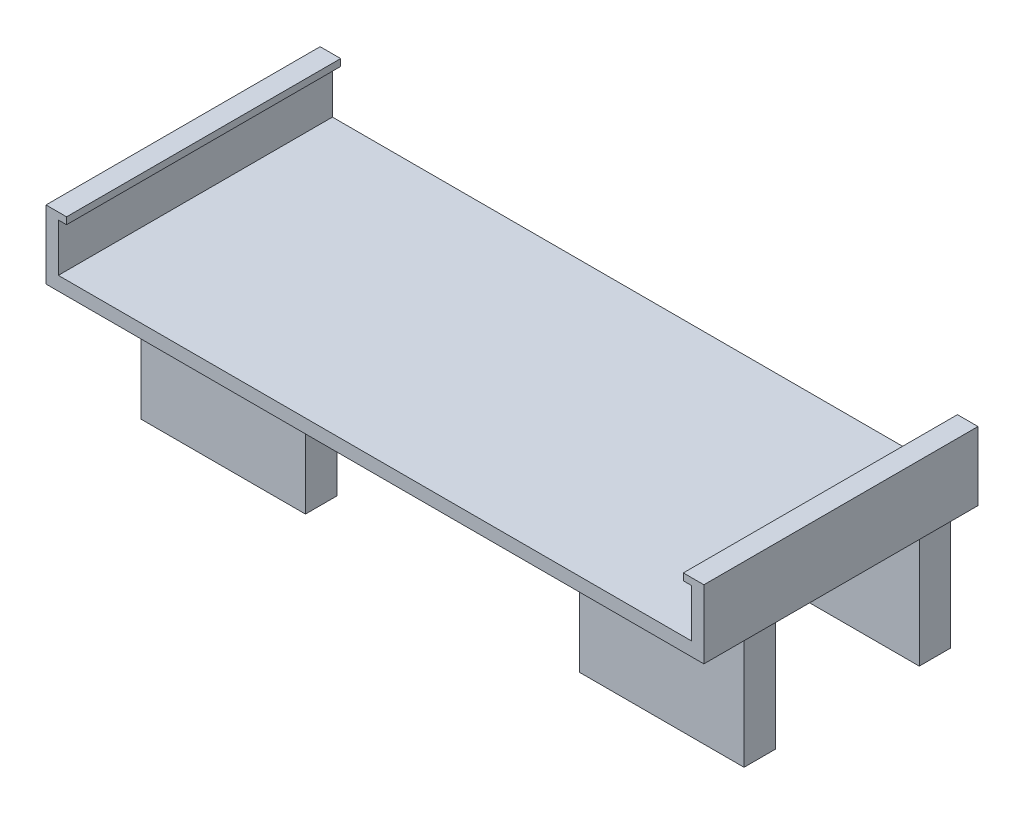
ISO-10303-21;
HEADER;
FILE_DESCRIPTION(('STEP AP214'),'2;1');
FILE_NAME('part.step','',(''),(''),'','','');
FILE_SCHEMA(('AUTOMOTIVE_DESIGN { 1 0 10303 214 1 1 1 1 }'));
ENDSEC;
DATA;
#1=APPLICATION_CONTEXT('core data for automotive mechanical design processes');
#2=APPLICATION_PROTOCOL_DEFINITION('international standard','automotive_design',2000,#1);
#3=PRODUCT_CONTEXT('',#1,'mechanical');
#4=PRODUCT('Part','Part','',(#3));
#5=PRODUCT_RELATED_PRODUCT_CATEGORY('part','',(#4));
#6=PRODUCT_DEFINITION_FORMATION('','',#4);
#7=PRODUCT_DEFINITION_CONTEXT('part definition',#1,'design');
#8=PRODUCT_DEFINITION('design','',#6,#7);
#9=PRODUCT_DEFINITION_SHAPE('','',#8);
#10=(LENGTH_UNIT() NAMED_UNIT(*) SI_UNIT(.MILLI.,.METRE.));
#11=(NAMED_UNIT(*) PLANE_ANGLE_UNIT() SI_UNIT($,.RADIAN.));
#12=(NAMED_UNIT(*) SI_UNIT($,.STERADIAN.) SOLID_ANGLE_UNIT());
#13=UNCERTAINTY_MEASURE_WITH_UNIT(LENGTH_MEASURE(1.E-05),#10,'distance_accuracy_value','');
#14=(GEOMETRIC_REPRESENTATION_CONTEXT(3) GLOBAL_UNCERTAINTY_ASSIGNED_CONTEXT((#13)) GLOBAL_UNIT_ASSIGNED_CONTEXT((#10,
#11,#12)) REPRESENTATION_CONTEXT('',''));
#15=CARTESIAN_POINT('',(0.,0.,0.));
#16=DIRECTION('',(0.,0.,1.));
#17=DIRECTION('',(1.,0.,0.));
#18=AXIS2_PLACEMENT_3D('',#15,#16,#17);
#19=CARTESIAN_POINT('',(0.,-10.,0.));
#20=DIRECTION('',(0.,-1.,0.));
#21=DIRECTION('',(0.,0.,-1.));
#22=AXIS2_PLACEMENT_3D('',#19,#20,#21);
#23=PLANE('',#22);
#24=DIRECTION('',(1.,0.,0.));
#25=VECTOR('',#24,1.);
#26=CARTESIAN_POINT('',(-24.78,-10.,-12.3407142857143));
#27=LINE('',#26,#25);
#28=CARTESIAN_POINT('',(-22.78,-10.,-12.3407142857143));
#29=VERTEX_POINT('',#28);
#30=CARTESIAN_POINT('',(-10.78,-10.,-12.3407142857143));
#31=VERTEX_POINT('',#30);
#32=EDGE_CURVE('E256',#29,#31,#27,.T.);
#33=ORIENTED_EDGE('',*,*,#32,.F.);
#34=DIRECTION('',(0.,0.,-1.));
#35=VECTOR('',#34,1.);
#36=CARTESIAN_POINT('',(-22.78,-10.,0.444285714285717));
#37=LINE('',#36,#35);
#38=CARTESIAN_POINT('',(-22.78,-10.,-14.6257142857143));
#39=VERTEX_POINT('',#38);
#40=EDGE_CURVE('E338',#29,#39,#37,.T.);
#41=ORIENTED_EDGE('',*,*,#40,.T.);
#42=DIRECTION('',(1.,0.,0.));
#43=VECTOR('',#42,1.);
#44=CARTESIAN_POINT('',(-22.78,-10.,-14.6257142857143));
#45=LINE('',#44,#43);
#46=CARTESIAN_POINT('',(-10.78,-10.,-14.6257142857143));
#47=VERTEX_POINT('',#46);
#48=EDGE_CURVE('E344',#39,#47,#45,.T.);
#49=ORIENTED_EDGE('',*,*,#48,.T.);
#50=DIRECTION('',(0.,0.,1.));
#51=VECTOR('',#50,1.);
#52=CARTESIAN_POINT('',(-10.78,-10.,-14.6257142857143));
#53=LINE('',#52,#51);
#54=EDGE_CURVE('E348',#47,#31,#53,.T.);
#55=ORIENTED_EDGE('',*,*,#54,.T.);
#56=EDGE_LOOP('',(#33,#41,#49,#55));
#57=FACE_BOUND('',#56,.T.);
#58=ADVANCED_FACE('F39',(#57),#23,.T.);
#59=CARTESIAN_POINT('',(0.,-10.,0.));
#60=DIRECTION('',(0.,-1.,0.));
#61=DIRECTION('',(0.,0.,-1.));
#62=AXIS2_PLACEMENT_3D('',#59,#60,#61);
#63=PLANE('',#62);
#64=DIRECTION('',(1.,0.,0.));
#65=VECTOR('',#64,1.);
#66=CARTESIAN_POINT('',(0.,-10.,-12.3407142857143));
#67=LINE('',#66,#65);
#68=CARTESIAN_POINT('',(9.21999999999999,-10.,-12.3407142857143));
#69=VERTEX_POINT('',#68);
#70=CARTESIAN_POINT('',(21.22,-10.,-12.3407142857143));
#71=VERTEX_POINT('',#70);
#72=EDGE_CURVE('E11',#69,#71,#67,.T.);
#73=ORIENTED_EDGE('',*,*,#72,.F.);
#74=DIRECTION('',(0.,0.,-1.));
#75=VECTOR('',#74,1.);
#76=CARTESIAN_POINT('',(9.22,-10.,0.444285714285717));
#77=LINE('',#76,#75);
#78=CARTESIAN_POINT('',(9.21999999999999,-10.,-14.6257142857143));
#79=VERTEX_POINT('',#78);
#80=EDGE_CURVE('E298',#69,#79,#77,.T.);
#81=ORIENTED_EDGE('',*,*,#80,.T.);
#82=DIRECTION('',(1.,0.,0.));
#83=VECTOR('',#82,1.);
#84=CARTESIAN_POINT('',(9.21999999999999,-10.,-14.6257142857143));
#85=LINE('',#84,#83);
#86=CARTESIAN_POINT('',(21.22,-10.,-14.6257142857143));
#87=VERTEX_POINT('',#86);
#88=EDGE_CURVE('E304',#79,#87,#85,.T.);
#89=ORIENTED_EDGE('',*,*,#88,.T.);
#90=DIRECTION('',(0.,0.,1.));
#91=VECTOR('',#90,1.);
#92=CARTESIAN_POINT('',(21.22,-10.,-14.6257142857143));
#93=LINE('',#92,#91);
#94=EDGE_CURVE('E307',#87,#71,#93,.T.);
#95=ORIENTED_EDGE('',*,*,#94,.T.);
#96=EDGE_LOOP('',(#73,#81,#89,#95));
#97=FACE_BOUND('',#96,.T.);
#98=ADVANCED_FACE('F595',(#97),#63,.T.);
#99=CARTESIAN_POINT('',(0.,0.,0.));
#100=DIRECTION('',(0.,1.,0.));
#101=DIRECTION('',(0.,0.,1.));
#102=AXIS2_PLACEMENT_3D('',#99,#100,#101);
#103=PLANE('',#102);
#104=DIRECTION('',(0.,0.,-1.));
#105=VECTOR('',#104,1.);
#106=CARTESIAN_POINT('',(9.22,0.,0.444285714285717));
#107=LINE('',#106,#105);
#108=CARTESIAN_POINT('',(9.22,0.,0.444285714285717));
#109=VERTEX_POINT('',#108);
#110=CARTESIAN_POINT('',(9.22,0.,-14.6257142857143));
#111=VERTEX_POINT('',#110);
#112=EDGE_CURVE('E315',#109,#111,#107,.T.);
#113=ORIENTED_EDGE('',*,*,#112,.F.);
#114=DIRECTION('',(-1.,0.,0.));
#115=VECTOR('',#114,1.);
#116=CARTESIAN_POINT('',(21.22,0.,0.444285714285718));
#117=LINE('',#116,#115);
#118=CARTESIAN_POINT('',(21.22,0.,0.444285714285718));
#119=VERTEX_POINT('',#118);
#120=EDGE_CURVE('E293',#119,#109,#117,.T.);
#121=ORIENTED_EDGE('',*,*,#120,.F.);
#122=DIRECTION('',(0.,0.,1.));
#123=VECTOR('',#122,1.);
#124=CARTESIAN_POINT('',(21.22,0.,-14.6257142857143));
#125=LINE('',#124,#123);
#126=CARTESIAN_POINT('',(21.22,0.,-14.6257142857143));
#127=VERTEX_POINT('',#126);
#128=EDGE_CURVE('E299',#127,#119,#125,.T.);
#129=ORIENTED_EDGE('',*,*,#128,.F.);
#130=DIRECTION('',(-1.,0.,0.));
#131=VECTOR('',#130,1.);
#132=CARTESIAN_POINT('',(-24.78,0.,-14.6257142857143));
#133=LINE('',#132,#131);
#134=CARTESIAN_POINT('',(23.22,0.,-14.6257142857143));
#135=VERTEX_POINT('',#134);
#136=EDGE_CURVE('E464',#135,#127,#133,.T.);
#137=ORIENTED_EDGE('',*,*,#136,.F.);
#138=DIRECTION('',(0.,0.,-1.));
#139=VECTOR('',#138,1.);
#140=CARTESIAN_POINT('',(23.22,0.,-14.6257142857143));
#141=LINE('',#140,#139);
#142=CARTESIAN_POINT('',(23.22,0.,5.37428571428572));
#143=VERTEX_POINT('',#142);
#144=EDGE_CURVE('E484',#143,#135,#141,.T.);
#145=ORIENTED_EDGE('',*,*,#144,.F.);
#146=DIRECTION('',(1.,0.,0.));
#147=VECTOR('',#146,1.);
#148=CARTESIAN_POINT('',(-24.78,0.,5.37428571428572));
#149=LINE('',#148,#147);
#150=CARTESIAN_POINT('',(-24.78,0.,5.37428571428572));
#151=VERTEX_POINT('',#150);
#152=EDGE_CURVE('E481',#151,#143,#149,.T.);
#153=ORIENTED_EDGE('',*,*,#152,.F.);
#154=DIRECTION('',(0.,0.,1.));
#155=VECTOR('',#154,1.);
#156=CARTESIAN_POINT('',(-24.78,0.,-14.6257142857143));
#157=LINE('',#156,#155);
#158=CARTESIAN_POINT('',(-24.78,0.,-14.6257142857143));
#159=VERTEX_POINT('',#158);
#160=EDGE_CURVE('E438',#159,#151,#157,.T.);
#161=ORIENTED_EDGE('',*,*,#160,.F.);
#162=CARTESIAN_POINT('',(-22.78,0.,-14.6257142857143));
#163=VERTEX_POINT('',#162);
#164=EDGE_CURVE('E487',#163,#159,#133,.T.);
#165=ORIENTED_EDGE('',*,*,#164,.F.);
#166=DIRECTION('',(0.,0.,-1.));
#167=VECTOR('',#166,1.);
#168=CARTESIAN_POINT('',(-22.78,0.,0.444285714285717));
#169=LINE('',#168,#167);
#170=CARTESIAN_POINT('',(-22.78,0.,0.444285714285717));
#171=VERTEX_POINT('',#170);
#172=EDGE_CURVE('E356',#171,#163,#169,.T.);
#173=ORIENTED_EDGE('',*,*,#172,.F.);
#174=DIRECTION('',(-1.,0.,0.));
#175=VECTOR('',#174,1.);
#176=CARTESIAN_POINT('',(-10.78,0.,0.444285714285718));
#177=LINE('',#176,#175);
#178=CARTESIAN_POINT('',(-10.78,0.,0.444285714285718));
#179=VERTEX_POINT('',#178);
#180=EDGE_CURVE('E333',#179,#171,#177,.T.);
#181=ORIENTED_EDGE('',*,*,#180,.F.);
#182=DIRECTION('',(0.,0.,1.));
#183=VECTOR('',#182,1.);
#184=CARTESIAN_POINT('',(-10.78,0.,-14.6257142857143));
#185=LINE('',#184,#183);
#186=CARTESIAN_POINT('',(-10.78,0.,-14.6257142857143));
#187=VERTEX_POINT('',#186);
#188=EDGE_CURVE('E339',#187,#179,#185,.T.);
#189=ORIENTED_EDGE('',*,*,#188,.F.);
#190=EDGE_CURVE('E491',#111,#187,#133,.T.);
#191=ORIENTED_EDGE('',*,*,#190,.F.);
#192=EDGE_LOOP('',(#113,#121,#129,#137,#145,#153,#161,#165,#173,#181,#189,#191));
#193=FACE_BOUND('',#192,.T.);
#194=ADVANCED_FACE('F523',(#193),#103,.F.);
#195=CARTESIAN_POINT('',(0.,5.,0.));
#196=DIRECTION('',(0.,1.,0.));
#197=DIRECTION('',(0.,0.,1.));
#198=AXIS2_PLACEMENT_3D('',#195,#196,#197);
#199=PLANE('',#198);
#200=DIRECTION('',(0.,0.,1.));
#201=VECTOR('',#200,1.);
#202=CARTESIAN_POINT('',(21.72,5.,-14.6257142857143));
#203=LINE('',#202,#201);
#204=CARTESIAN_POINT('',(21.72,5.,-14.6257142857143));
#205=VERTEX_POINT('',#204);
#206=CARTESIAN_POINT('',(21.72,5.,5.37428571428572));
#207=VERTEX_POINT('',#206);
#208=EDGE_CURVE('E434',#205,#207,#203,.T.);
#209=ORIENTED_EDGE('',*,*,#208,.T.);
#210=DIRECTION('',(1.,0.,0.));
#211=VECTOR('',#210,1.);
#212=CARTESIAN_POINT('',(-24.78,5.,5.37428571428572));
#213=LINE('',#212,#211);
#214=CARTESIAN_POINT('',(23.22,5.,5.37428571428572));
#215=VERTEX_POINT('',#214);
#216=EDGE_CURVE('E463',#207,#215,#213,.T.);
#217=ORIENTED_EDGE('',*,*,#216,.T.);
#218=DIRECTION('',(0.,0.,-1.));
#219=VECTOR('',#218,1.);
#220=CARTESIAN_POINT('',(23.22,5.,-14.6257142857143));
#221=LINE('',#220,#219);
#222=CARTESIAN_POINT('',(23.22,5.,-14.6257142857143));
#223=VERTEX_POINT('',#222);
#224=EDGE_CURVE('E469',#215,#223,#221,.T.);
#225=ORIENTED_EDGE('',*,*,#224,.T.);
#226=DIRECTION('',(-1.,0.,0.));
#227=VECTOR('',#226,1.);
#228=CARTESIAN_POINT('',(-24.78,5.,-14.6257142857143));
#229=LINE('',#228,#227);
#230=EDGE_CURVE('E473',#223,#205,#229,.T.);
#231=ORIENTED_EDGE('',*,*,#230,.T.);
#232=EDGE_LOOP('',(#209,#217,#225,#231));
#233=FACE_BOUND('',#232,.T.);
#234=ADVANCED_FACE('F551',(#233),#199,.T.);
#235=CARTESIAN_POINT('',(-24.78,5.,-14.6257142857143));
#236=DIRECTION('',(1.,0.,0.));
#237=DIRECTION('',(0.,0.,-1.));
#238=AXIS2_PLACEMENT_3D('',#235,#236,#237);
#239=PLANE('',#238);
#240=ORIENTED_EDGE('',*,*,#160,.T.);
#241=DIRECTION('',(0.,-1.,0.));
#242=VECTOR('',#241,1.);
#243=CARTESIAN_POINT('',(-24.78,5.,5.37428571428572));
#244=LINE('',#243,#242);
#245=CARTESIAN_POINT('',(-24.78,5.,5.37428571428572));
#246=VERTEX_POINT('',#245);
#247=EDGE_CURVE('E503',#246,#151,#244,.T.);
#248=ORIENTED_EDGE('',*,*,#247,.F.);
#249=DIRECTION('',(0.,0.,1.));
#250=VECTOR('',#249,1.);
#251=CARTESIAN_POINT('',(-24.78,5.,-14.6257142857143));
#252=LINE('',#251,#250);
#253=CARTESIAN_POINT('',(-24.78,5.,-14.6257142857143));
#254=VERTEX_POINT('',#253);
#255=EDGE_CURVE('E459',#254,#246,#252,.T.);
#256=ORIENTED_EDGE('',*,*,#255,.F.);
#257=DIRECTION('',(0.,-1.,0.));
#258=VECTOR('',#257,1.);
#259=CARTESIAN_POINT('',(-24.78,5.,-14.6257142857143));
#260=LINE('',#259,#258);
#261=EDGE_CURVE('E477',#254,#159,#260,.T.);
#262=ORIENTED_EDGE('',*,*,#261,.T.);
#263=EDGE_LOOP('',(#240,#248,#256,#262));
#264=FACE_BOUND('',#263,.T.);
#265=ADVANCED_FACE('F41',(#264),#239,.F.);
#266=CARTESIAN_POINT('',(-24.78,5.,5.37428571428572));
#267=DIRECTION('',(0.,0.,-1.));
#268=DIRECTION('',(-1.,0.,0.));
#269=AXIS2_PLACEMENT_3D('',#266,#267,#268);
#270=PLANE('',#269);
#271=ORIENTED_EDGE('',*,*,#216,.F.);
#272=DIRECTION('',(0.,1.,0.));
#273=VECTOR('',#272,1.);
#274=CARTESIAN_POINT('',(21.72,4.50000000000001,5.37428571428572));
#275=LINE('',#274,#273);
#276=CARTESIAN_POINT('',(21.72,4.50000000000001,5.37428571428572));
#277=VERTEX_POINT('',#276);
#278=EDGE_CURVE('E384',#277,#207,#275,.T.);
#279=ORIENTED_EDGE('',*,*,#278,.F.);
#280=DIRECTION('',(-1.,0.,0.));
#281=VECTOR('',#280,1.);
#282=CARTESIAN_POINT('',(22.32,4.50000000000001,5.37428571428572));
#283=LINE('',#282,#281);
#284=CARTESIAN_POINT('',(22.32,4.50000000000001,5.37428571428572));
#285=VERTEX_POINT('',#284);
#286=EDGE_CURVE('E428',#285,#277,#283,.T.);
#287=ORIENTED_EDGE('',*,*,#286,.F.);
#288=DIRECTION('',(0.,1.,0.));
#289=VECTOR('',#288,1.);
#290=CARTESIAN_POINT('',(22.32,1.,5.37428571428572));
#291=LINE('',#290,#289);
#292=CARTESIAN_POINT('',(22.32,1.,5.37428571428572));
#293=VERTEX_POINT('',#292);
#294=EDGE_CURVE('E424',#293,#285,#291,.T.);
#295=ORIENTED_EDGE('',*,*,#294,.F.);
#296=DIRECTION('',(1.,0.,0.));
#297=VECTOR('',#296,1.);
#298=CARTESIAN_POINT('',(-23.88,1.,5.37428571428572));
#299=LINE('',#298,#297);
#300=CARTESIAN_POINT('',(-23.88,1.,5.37428571428572));
#301=VERTEX_POINT('',#300);
#302=EDGE_CURVE('E420',#301,#293,#299,.T.);
#303=ORIENTED_EDGE('',*,*,#302,.F.);
#304=DIRECTION('',(0.,-1.,0.));
#305=VECTOR('',#304,1.);
#306=CARTESIAN_POINT('',(-23.88,4.5,5.37428571428572));
#307=LINE('',#306,#305);
#308=CARTESIAN_POINT('',(-23.88,4.5,5.37428571428572));
#309=VERTEX_POINT('',#308);
#310=EDGE_CURVE('E416',#309,#301,#307,.T.);
#311=ORIENTED_EDGE('',*,*,#310,.F.);
#312=DIRECTION('',(-1.,0.,0.));
#313=VECTOR('',#312,1.);
#314=CARTESIAN_POINT('',(-23.28,4.5,5.37428571428572));
#315=LINE('',#314,#313);
#316=CARTESIAN_POINT('',(-23.28,4.5,5.37428571428572));
#317=VERTEX_POINT('',#316);
#318=EDGE_CURVE('E412',#317,#309,#315,.T.);
#319=ORIENTED_EDGE('',*,*,#318,.F.);
#320=DIRECTION('',(0.,-1.,0.));
#321=VECTOR('',#320,1.);
#322=CARTESIAN_POINT('',(-23.28,5.,5.37428571428572));
#323=LINE('',#322,#321);
#324=CARTESIAN_POINT('',(-23.28,5.,5.37428571428572));
#325=VERTEX_POINT('',#324);
#326=EDGE_CURVE('E378',#325,#317,#323,.T.);
#327=ORIENTED_EDGE('',*,*,#326,.F.);
#328=EDGE_CURVE('E465',#246,#325,#213,.T.);
#329=ORIENTED_EDGE('',*,*,#328,.F.);
#330=ORIENTED_EDGE('',*,*,#247,.T.);
#331=ORIENTED_EDGE('',*,*,#152,.T.);
#332=DIRECTION('',(0.,-1.,0.));
#333=VECTOR('',#332,1.);
#334=CARTESIAN_POINT('',(23.22,5.,5.37428571428572));
#335=LINE('',#334,#333);
#336=EDGE_CURVE('E499',#215,#143,#335,.T.);
#337=ORIENTED_EDGE('',*,*,#336,.F.);
#338=EDGE_LOOP('',(#271,#279,#287,#295,#303,#311,#319,#327,#329,#330,#331,#337));
#339=FACE_BOUND('',#338,.T.);
#340=ADVANCED_FACE('F542',(#339),#270,.F.);
#341=CARTESIAN_POINT('',(23.22,5.,-14.6257142857143));
#342=DIRECTION('',(-1.,0.,0.));
#343=DIRECTION('',(0.,0.,1.));
#344=AXIS2_PLACEMENT_3D('',#341,#342,#343);
#345=PLANE('',#344);
#346=ORIENTED_EDGE('',*,*,#144,.T.);
#347=DIRECTION('',(0.,-1.,0.));
#348=VECTOR('',#347,1.);
#349=CARTESIAN_POINT('',(23.22,5.,-14.6257142857143));
#350=LINE('',#349,#348);
#351=EDGE_CURVE('E495',#223,#135,#350,.T.);
#352=ORIENTED_EDGE('',*,*,#351,.F.);
#353=ORIENTED_EDGE('',*,*,#224,.F.);
#354=ORIENTED_EDGE('',*,*,#336,.T.);
#355=EDGE_LOOP('',(#346,#352,#353,#354));
#356=FACE_BOUND('',#355,.T.);
#357=ADVANCED_FACE('F556',(#356),#345,.F.);
#358=CARTESIAN_POINT('',(-24.78,5.,-14.6257142857143));
#359=DIRECTION('',(0.,0.,1.));
#360=DIRECTION('',(1.,0.,0.));
#361=AXIS2_PLACEMENT_3D('',#358,#359,#360);
#362=PLANE('',#361);
#363=DIRECTION('',(-1.,0.,0.));
#364=VECTOR('',#363,1.);
#365=CARTESIAN_POINT('',(22.32,4.50000000000001,-14.6257142857143));
#366=LINE('',#365,#364);
#367=CARTESIAN_POINT('',(22.32,4.50000000000001,-14.6257142857143));
#368=VERTEX_POINT('',#367);
#369=CARTESIAN_POINT('',(21.72,4.50000000000001,-14.6257142857143));
#370=VERTEX_POINT('',#369);
#371=EDGE_CURVE('E400',#368,#370,#366,.T.);
#372=ORIENTED_EDGE('',*,*,#371,.T.);
#373=DIRECTION('',(0.,1.,0.));
#374=VECTOR('',#373,1.);
#375=CARTESIAN_POINT('',(21.72,4.50000000000001,-14.6257142857143));
#376=LINE('',#375,#374);
#377=EDGE_CURVE('E404',#370,#205,#376,.T.);
#378=ORIENTED_EDGE('',*,*,#377,.T.);
#379=ORIENTED_EDGE('',*,*,#230,.F.);
#380=ORIENTED_EDGE('',*,*,#351,.T.);
#381=ORIENTED_EDGE('',*,*,#136,.T.);
#382=DIRECTION('',(0.,1.,0.));
#383=VECTOR('',#382,1.);
#384=CARTESIAN_POINT('',(21.22,-10.,-14.6257142857143));
#385=LINE('',#384,#383);
#386=EDGE_CURVE('E324',#87,#127,#385,.T.);
#387=ORIENTED_EDGE('',*,*,#386,.F.);
#388=ORIENTED_EDGE('',*,*,#88,.F.);
#389=DIRECTION('',(0.,1.,0.));
#390=VECTOR('',#389,1.);
#391=CARTESIAN_POINT('',(9.21999999999999,-10.,-14.6257142857143));
#392=LINE('',#391,#390);
#393=EDGE_CURVE('E327',#79,#111,#392,.T.);
#394=ORIENTED_EDGE('',*,*,#393,.T.);
#395=ORIENTED_EDGE('',*,*,#190,.T.);
#396=DIRECTION('',(0.,1.,0.));
#397=VECTOR('',#396,1.);
#398=CARTESIAN_POINT('',(-10.78,-10.,-14.6257142857143));
#399=LINE('',#398,#397);
#400=EDGE_CURVE('E366',#47,#187,#399,.T.);
#401=ORIENTED_EDGE('',*,*,#400,.F.);
#402=ORIENTED_EDGE('',*,*,#48,.F.);
#403=DIRECTION('',(0.,1.,0.));
#404=VECTOR('',#403,1.);
#405=CARTESIAN_POINT('',(-22.78,-10.,-14.6257142857143));
#406=LINE('',#405,#404);
#407=EDGE_CURVE('E370',#39,#163,#406,.T.);
#408=ORIENTED_EDGE('',*,*,#407,.T.);
#409=ORIENTED_EDGE('',*,*,#164,.T.);
#410=ORIENTED_EDGE('',*,*,#261,.F.);
#411=CARTESIAN_POINT('',(-23.28,5.,-14.6257142857143));
#412=VERTEX_POINT('',#411);
#413=EDGE_CURVE('E472',#412,#254,#229,.T.);
#414=ORIENTED_EDGE('',*,*,#413,.F.);
#415=DIRECTION('',(0.,-1.,0.));
#416=VECTOR('',#415,1.);
#417=CARTESIAN_POINT('',(-23.28,5.,-14.6257142857143));
#418=LINE('',#417,#416);
#419=CARTESIAN_POINT('',(-23.28,4.5,-14.6257142857143));
#420=VERTEX_POINT('',#419);
#421=EDGE_CURVE('E379',#412,#420,#418,.T.);
#422=ORIENTED_EDGE('',*,*,#421,.T.);
#423=DIRECTION('',(-1.,0.,0.));
#424=VECTOR('',#423,1.);
#425=CARTESIAN_POINT('',(-23.28,4.5,-14.6257142857143));
#426=LINE('',#425,#424);
#427=CARTESIAN_POINT('',(-23.88,4.5,-14.6257142857143));
#428=VERTEX_POINT('',#427);
#429=EDGE_CURVE('E383',#420,#428,#426,.T.);
#430=ORIENTED_EDGE('',*,*,#429,.T.);
#431=DIRECTION('',(0.,-1.,0.));
#432=VECTOR('',#431,1.);
#433=CARTESIAN_POINT('',(-23.88,4.5,-14.6257142857143));
#434=LINE('',#433,#432);
#435=CARTESIAN_POINT('',(-23.88,1.,-14.6257142857143));
#436=VERTEX_POINT('',#435);
#437=EDGE_CURVE('E388',#428,#436,#434,.T.);
#438=ORIENTED_EDGE('',*,*,#437,.T.);
#439=DIRECTION('',(1.,0.,0.));
#440=VECTOR('',#439,1.);
#441=CARTESIAN_POINT('',(-23.88,1.,-14.6257142857143));
#442=LINE('',#441,#440);
#443=CARTESIAN_POINT('',(22.32,1.,-14.6257142857143));
#444=VERTEX_POINT('',#443);
#445=EDGE_CURVE('E392',#436,#444,#442,.T.);
#446=ORIENTED_EDGE('',*,*,#445,.T.);
#447=DIRECTION('',(0.,1.,0.));
#448=VECTOR('',#447,1.);
#449=CARTESIAN_POINT('',(22.32,1.,-14.6257142857143));
#450=LINE('',#449,#448);
#451=EDGE_CURVE('E396',#444,#368,#450,.T.);
#452=ORIENTED_EDGE('',*,*,#451,.T.);
#453=EDGE_LOOP('',(#372,#378,#379,#380,#381,#387,#388,#394,#395,#401,#402,#408,#409,#410,#414,
#422,#430,#438,#446,#452));
#454=FACE_BOUND('',#453,.T.);
#455=ADVANCED_FACE('F529',(#454),#362,.F.);
#456=DIRECTION('',(0.,0.,1.));
#457=VECTOR('',#456,1.);
#458=CARTESIAN_POINT('',(-23.28,5.,-14.6257142857143));
#459=LINE('',#458,#457);
#460=EDGE_CURVE('E408',#412,#325,#459,.T.);
#461=ORIENTED_EDGE('',*,*,#460,.F.);
#462=ORIENTED_EDGE('',*,*,#413,.T.);
#463=ORIENTED_EDGE('',*,*,#255,.T.);
#464=ORIENTED_EDGE('',*,*,#328,.T.);
#465=EDGE_LOOP('',(#461,#462,#463,#464));
#466=FACE_BOUND('',#465,.T.);
#467=ADVANCED_FACE('F547',(#466),#199,.T.);
#468=CARTESIAN_POINT('',(21.72,4.50000000000001,-14.6257142857143));
#469=DIRECTION('',(1.,0.,0.));
#470=DIRECTION('',(0.,0.,-1.));
#471=AXIS2_PLACEMENT_3D('',#468,#469,#470);
#472=PLANE('',#471);
#473=ORIENTED_EDGE('',*,*,#278,.T.);
#474=ORIENTED_EDGE('',*,*,#208,.F.);
#475=ORIENTED_EDGE('',*,*,#377,.F.);
#476=DIRECTION('',(0.,0.,1.));
#477=VECTOR('',#476,1.);
#478=CARTESIAN_POINT('',(21.72,4.50000000000001,-14.6257142857143));
#479=LINE('',#478,#477);
#480=EDGE_CURVE('E439',#370,#277,#479,.T.);
#481=ORIENTED_EDGE('',*,*,#480,.T.);
#482=EDGE_LOOP('',(#473,#474,#475,#481));
#483=FACE_BOUND('',#482,.T.);
#484=ADVANCED_FACE('F561',(#483),#472,.F.);
#485=CARTESIAN_POINT('',(22.32,4.50000000000001,-14.6257142857143));
#486=DIRECTION('',(0.,1.,0.));
#487=DIRECTION('',(-1.,0.,0.));
#488=AXIS2_PLACEMENT_3D('',#485,#486,#487);
#489=PLANE('',#488);
#490=ORIENTED_EDGE('',*,*,#286,.T.);
#491=ORIENTED_EDGE('',*,*,#480,.F.);
#492=ORIENTED_EDGE('',*,*,#371,.F.);
#493=DIRECTION('',(0.,0.,1.));
#494=VECTOR('',#493,1.);
#495=CARTESIAN_POINT('',(22.32,4.50000000000001,-14.6257142857143));
#496=LINE('',#495,#494);
#497=EDGE_CURVE('E442',#368,#285,#496,.T.);
#498=ORIENTED_EDGE('',*,*,#497,.T.);
#499=EDGE_LOOP('',(#490,#491,#492,#498));
#500=FACE_BOUND('',#499,.T.);
#501=ADVANCED_FACE('F566',(#500),#489,.F.);
#502=CARTESIAN_POINT('',(22.32,1.,-14.6257142857143));
#503=DIRECTION('',(1.,0.,0.));
#504=DIRECTION('',(0.,0.,-1.));
#505=AXIS2_PLACEMENT_3D('',#502,#503,#504);
#506=PLANE('',#505);
#507=ORIENTED_EDGE('',*,*,#294,.T.);
#508=ORIENTED_EDGE('',*,*,#497,.F.);
#509=ORIENTED_EDGE('',*,*,#451,.F.);
#510=DIRECTION('',(0.,0.,1.));
#511=VECTOR('',#510,1.);
#512=CARTESIAN_POINT('',(22.32,1.,-14.6257142857143));
#513=LINE('',#512,#511);
#514=EDGE_CURVE('E445',#444,#293,#513,.T.);
#515=ORIENTED_EDGE('',*,*,#514,.T.);
#516=EDGE_LOOP('',(#507,#508,#509,#515));
#517=FACE_BOUND('',#516,.T.);
#518=ADVANCED_FACE('F569',(#517),#506,.F.);
#519=CARTESIAN_POINT('',(-23.88,1.,-14.6257142857143));
#520=DIRECTION('',(0.,-1.,0.));
#521=DIRECTION('',(0.,0.,-1.));
#522=AXIS2_PLACEMENT_3D('',#519,#520,#521);
#523=PLANE('',#522);
#524=ORIENTED_EDGE('',*,*,#302,.T.);
#525=ORIENTED_EDGE('',*,*,#514,.F.);
#526=ORIENTED_EDGE('',*,*,#445,.F.);
#527=DIRECTION('',(0.,0.,1.));
#528=VECTOR('',#527,1.);
#529=CARTESIAN_POINT('',(-23.88,1.,-14.6257142857143));
#530=LINE('',#529,#528);
#531=EDGE_CURVE('E448',#436,#301,#530,.T.);
#532=ORIENTED_EDGE('',*,*,#531,.T.);
#533=EDGE_LOOP('',(#524,#525,#526,#532));
#534=FACE_BOUND('',#533,.T.);
#535=ADVANCED_FACE('F572',(#534),#523,.F.);
#536=CARTESIAN_POINT('',(-23.88,4.5,-14.6257142857143));
#537=DIRECTION('',(-1.,0.,0.));
#538=DIRECTION('',(0.,0.,1.));
#539=AXIS2_PLACEMENT_3D('',#536,#537,#538);
#540=PLANE('',#539);
#541=ORIENTED_EDGE('',*,*,#310,.T.);
#542=ORIENTED_EDGE('',*,*,#531,.F.);
#543=ORIENTED_EDGE('',*,*,#437,.F.);
#544=DIRECTION('',(0.,0.,1.));
#545=VECTOR('',#544,1.);
#546=CARTESIAN_POINT('',(-23.88,4.5,-14.6257142857143));
#547=LINE('',#546,#545);
#548=EDGE_CURVE('E451',#428,#309,#547,.T.);
#549=ORIENTED_EDGE('',*,*,#548,.T.);
#550=EDGE_LOOP('',(#541,#542,#543,#549));
#551=FACE_BOUND('',#550,.T.);
#552=ADVANCED_FACE('F575',(#551),#540,.F.);
#553=CARTESIAN_POINT('',(-23.28,4.5,-14.6257142857143));
#554=DIRECTION('',(0.,1.,0.));
#555=DIRECTION('',(-1.,0.,0.));
#556=AXIS2_PLACEMENT_3D('',#553,#554,#555);
#557=PLANE('',#556);
#558=ORIENTED_EDGE('',*,*,#318,.T.);
#559=ORIENTED_EDGE('',*,*,#548,.F.);
#560=ORIENTED_EDGE('',*,*,#429,.F.);
#561=DIRECTION('',(0.,0.,1.));
#562=VECTOR('',#561,1.);
#563=CARTESIAN_POINT('',(-23.28,4.5,-14.6257142857143));
#564=LINE('',#563,#562);
#565=EDGE_CURVE('E454',#420,#317,#564,.T.);
#566=ORIENTED_EDGE('',*,*,#565,.T.);
#567=EDGE_LOOP('',(#558,#559,#560,#566));
#568=FACE_BOUND('',#567,.T.);
#569=ADVANCED_FACE('F579',(#568),#557,.F.);
#570=CARTESIAN_POINT('',(-23.28,5.,-14.6257142857143));
#571=DIRECTION('',(-1.,0.,0.));
#572=DIRECTION('',(0.,0.,1.));
#573=AXIS2_PLACEMENT_3D('',#570,#571,#572);
#574=PLANE('',#573);
#575=ORIENTED_EDGE('',*,*,#326,.T.);
#576=ORIENTED_EDGE('',*,*,#565,.F.);
#577=ORIENTED_EDGE('',*,*,#421,.F.);
#578=ORIENTED_EDGE('',*,*,#460,.T.);
#579=EDGE_LOOP('',(#575,#576,#577,#578));
#580=FACE_BOUND('',#579,.T.);
#581=ADVANCED_FACE('F581',(#580),#574,.F.);
#582=CARTESIAN_POINT('',(-10.78,-10.,0.444285714285718));
#583=DIRECTION('',(0.,0.,-1.));
#584=DIRECTION('',(-1.,0.,0.));
#585=AXIS2_PLACEMENT_3D('',#582,#583,#584);
#586=PLANE('',#585);
#587=ORIENTED_EDGE('',*,*,#180,.T.);
#588=DIRECTION('',(0.,1.,0.));
#589=VECTOR('',#588,1.);
#590=CARTESIAN_POINT('',(-22.78,-10.,0.444285714285717));
#591=LINE('',#590,#589);
#592=CARTESIAN_POINT('',(-22.78,-10.,0.444285714285717));
#593=VERTEX_POINT('',#592);
#594=EDGE_CURVE('E374',#593,#171,#591,.T.);
#595=ORIENTED_EDGE('',*,*,#594,.F.);
#596=DIRECTION('',(-1.,0.,0.));
#597=VECTOR('',#596,1.);
#598=CARTESIAN_POINT('',(-10.78,-10.,0.444285714285718));
#599=LINE('',#598,#597);
#600=CARTESIAN_POINT('',(-10.78,-10.,0.444285714285718));
#601=VERTEX_POINT('',#600);
#602=EDGE_CURVE('E334',#601,#593,#599,.T.);
#603=ORIENTED_EDGE('',*,*,#602,.F.);
#604=DIRECTION('',(0.,1.,0.));
#605=VECTOR('',#604,1.);
#606=CARTESIAN_POINT('',(-10.78,-10.,0.444285714285718));
#607=LINE('',#606,#605);
#608=EDGE_CURVE('E352',#601,#179,#607,.T.);
#609=ORIENTED_EDGE('',*,*,#608,.T.);
#610=EDGE_LOOP('',(#587,#595,#603,#609));
#611=FACE_BOUND('',#610,.T.);
#612=ADVANCED_FACE('F583',(#611),#586,.F.);
#613=CARTESIAN_POINT('',(-22.78,-10.,0.444285714285717));
#614=DIRECTION('',(1.,0.,0.));
#615=DIRECTION('',(0.,0.,-1.));
#616=AXIS2_PLACEMENT_3D('',#613,#614,#615);
#617=PLANE('',#616);
#618=ORIENTED_EDGE('',*,*,#40,.F.);
#619=DIRECTION('',(0.,1.,0.));
#620=VECTOR('',#619,1.);
#621=CARTESIAN_POINT('',(-22.78,-10.,-12.3407142857143));
#622=LINE('',#621,#620);
#623=CARTESIAN_POINT('',(-22.78,-2.,-12.3407142857143));
#624=VERTEX_POINT('',#623);
#625=EDGE_CURVE('E278',#29,#624,#622,.T.);
#626=ORIENTED_EDGE('',*,*,#625,.T.);
#627=DIRECTION('',(0.,0.,1.));
#628=VECTOR('',#627,1.);
#629=CARTESIAN_POINT('',(-22.78,-2.,0.444285714285718));
#630=LINE('',#629,#628);
#631=CARTESIAN_POINT('',(-22.78,-2.,-1.84071428571428));
#632=VERTEX_POINT('',#631);
#633=EDGE_CURVE('E289',#624,#632,#630,.T.);
#634=ORIENTED_EDGE('',*,*,#633,.T.);
#635=DIRECTION('',(0.,-1.,0.));
#636=VECTOR('',#635,1.);
#637=CARTESIAN_POINT('',(-22.78,-10.,-1.84071428571428));
#638=LINE('',#637,#636);
#639=CARTESIAN_POINT('',(-22.78,-10.,-1.84071428571428));
#640=VERTEX_POINT('',#639);
#641=EDGE_CURVE('E266',#632,#640,#638,.T.);
#642=ORIENTED_EDGE('',*,*,#641,.T.);
#643=EDGE_CURVE('E340',#593,#640,#37,.T.);
#644=ORIENTED_EDGE('',*,*,#643,.F.);
#645=ORIENTED_EDGE('',*,*,#594,.T.);
#646=ORIENTED_EDGE('',*,*,#172,.T.);
#647=ORIENTED_EDGE('',*,*,#407,.F.);
#648=EDGE_LOOP('',(#618,#626,#634,#642,#644,#645,#646,#647));
#649=FACE_BOUND('',#648,.T.);
#650=ADVANCED_FACE('F589',(#649),#617,.F.);
#651=CARTESIAN_POINT('',(-10.78,-10.,-14.6257142857143));
#652=DIRECTION('',(-1.,0.,0.));
#653=DIRECTION('',(0.,0.,1.));
#654=AXIS2_PLACEMENT_3D('',#651,#652,#653);
#655=PLANE('',#654);
#656=DIRECTION('',(0.,0.,-1.));
#657=VECTOR('',#656,1.);
#658=CARTESIAN_POINT('',(-10.78,-2.,-14.6257142857143));
#659=LINE('',#658,#657);
#660=CARTESIAN_POINT('',(-10.78,-2.,-1.84071428571428));
#661=VERTEX_POINT('',#660);
#662=CARTESIAN_POINT('',(-10.78,-2.,-12.3407142857143));
#663=VERTEX_POINT('',#662);
#664=EDGE_CURVE('E285',#661,#663,#659,.T.);
#665=ORIENTED_EDGE('',*,*,#664,.T.);
#666=DIRECTION('',(0.,-1.,0.));
#667=VECTOR('',#666,1.);
#668=CARTESIAN_POINT('',(-10.78,-10.,-12.3407142857143));
#669=LINE('',#668,#667);
#670=EDGE_CURVE('E274',#663,#31,#669,.T.);
#671=ORIENTED_EDGE('',*,*,#670,.T.);
#672=ORIENTED_EDGE('',*,*,#54,.F.);
#673=ORIENTED_EDGE('',*,*,#400,.T.);
#674=ORIENTED_EDGE('',*,*,#188,.T.);
#675=ORIENTED_EDGE('',*,*,#608,.F.);
#676=CARTESIAN_POINT('',(-10.78,-10.,-1.84071428571428));
#677=VERTEX_POINT('',#676);
#678=EDGE_CURVE('E347',#677,#601,#53,.T.);
#679=ORIENTED_EDGE('',*,*,#678,.F.);
#680=DIRECTION('',(0.,1.,0.));
#681=VECTOR('',#680,1.);
#682=CARTESIAN_POINT('',(-10.78,-10.,-1.84071428571428));
#683=LINE('',#682,#681);
#684=EDGE_CURVE('E55',#677,#661,#683,.T.);
#685=ORIENTED_EDGE('',*,*,#684,.T.);
#686=EDGE_LOOP('',(#665,#671,#672,#673,#674,#675,#679,#685));
#687=FACE_BOUND('',#686,.T.);
#688=ADVANCED_FACE('F608',(#687),#655,.F.);
#689=DIRECTION('',(1.,0.,0.));
#690=VECTOR('',#689,1.);
#691=CARTESIAN_POINT('',(-24.78,-10.,-1.84071428571428));
#692=LINE('',#691,#690);
#693=EDGE_CURVE('E259',#640,#677,#692,.T.);
#694=ORIENTED_EDGE('',*,*,#693,.T.);
#695=ORIENTED_EDGE('',*,*,#678,.T.);
#696=ORIENTED_EDGE('',*,*,#602,.T.);
#697=ORIENTED_EDGE('',*,*,#643,.T.);
#698=EDGE_LOOP('',(#694,#695,#696,#697));
#699=FACE_BOUND('',#698,.T.);
#700=ADVANCED_FACE('F598',(#699),#23,.T.);
#701=CARTESIAN_POINT('',(21.22,-10.,0.444285714285718));
#702=DIRECTION('',(0.,0.,-1.));
#703=DIRECTION('',(-1.,0.,0.));
#704=AXIS2_PLACEMENT_3D('',#701,#702,#703);
#705=PLANE('',#704);
#706=ORIENTED_EDGE('',*,*,#120,.T.);
#707=DIRECTION('',(0.,1.,0.));
#708=VECTOR('',#707,1.);
#709=CARTESIAN_POINT('',(9.22,-10.,0.444285714285717));
#710=LINE('',#709,#708);
#711=CARTESIAN_POINT('',(9.22,-10.,0.444285714285717));
#712=VERTEX_POINT('',#711);
#713=EDGE_CURVE('E330',#712,#109,#710,.T.);
#714=ORIENTED_EDGE('',*,*,#713,.F.);
#715=DIRECTION('',(-1.,0.,0.));
#716=VECTOR('',#715,1.);
#717=CARTESIAN_POINT('',(21.22,-10.,0.444285714285718));
#718=LINE('',#717,#716);
#719=CARTESIAN_POINT('',(21.22,-10.,0.444285714285718));
#720=VERTEX_POINT('',#719);
#721=EDGE_CURVE('E294',#720,#712,#718,.T.);
#722=ORIENTED_EDGE('',*,*,#721,.F.);
#723=DIRECTION('',(0.,1.,0.));
#724=VECTOR('',#723,1.);
#725=CARTESIAN_POINT('',(21.22,-10.,0.444285714285718));
#726=LINE('',#725,#724);
#727=EDGE_CURVE('E311',#720,#119,#726,.T.);
#728=ORIENTED_EDGE('',*,*,#727,.T.);
#729=EDGE_LOOP('',(#706,#714,#722,#728));
#730=FACE_BOUND('',#729,.T.);
#731=ADVANCED_FACE('F515',(#730),#705,.F.);
#732=CARTESIAN_POINT('',(9.22,-10.,0.444285714285717));
#733=DIRECTION('',(1.,0.,0.));
#734=DIRECTION('',(0.,0.,-1.));
#735=AXIS2_PLACEMENT_3D('',#732,#733,#734);
#736=PLANE('',#735);
#737=ORIENTED_EDGE('',*,*,#80,.F.);
#738=DIRECTION('',(0.,1.,0.));
#739=VECTOR('',#738,1.);
#740=CARTESIAN_POINT('',(9.21999999999999,-10.,-12.3407142857143));
#741=LINE('',#740,#739);
#742=CARTESIAN_POINT('',(9.21999999999999,-2.,-12.3407142857143));
#743=VERTEX_POINT('',#742);
#744=EDGE_CURVE('E270',#69,#743,#741,.T.);
#745=ORIENTED_EDGE('',*,*,#744,.T.);
#746=DIRECTION('',(0.,0.,1.));
#747=VECTOR('',#746,1.);
#748=CARTESIAN_POINT('',(9.22,-2.,0.444285714285718));
#749=LINE('',#748,#747);
#750=CARTESIAN_POINT('',(9.22,-2.,-1.84071428571428));
#751=VERTEX_POINT('',#750);
#752=EDGE_CURVE('E282',#743,#751,#749,.T.);
#753=ORIENTED_EDGE('',*,*,#752,.T.);
#754=DIRECTION('',(0.,-1.,0.));
#755=VECTOR('',#754,1.);
#756=CARTESIAN_POINT('',(9.22,-10.,-1.84071428571428));
#757=LINE('',#756,#755);
#758=CARTESIAN_POINT('',(9.21999999999999,-10.,-1.84071428571428));
#759=VERTEX_POINT('',#758);
#760=EDGE_CURVE('E227',#751,#759,#757,.T.);
#761=ORIENTED_EDGE('',*,*,#760,.T.);
#762=EDGE_CURVE('E300',#712,#759,#77,.T.);
#763=ORIENTED_EDGE('',*,*,#762,.F.);
#764=ORIENTED_EDGE('',*,*,#713,.T.);
#765=ORIENTED_EDGE('',*,*,#112,.T.);
#766=ORIENTED_EDGE('',*,*,#393,.F.);
#767=EDGE_LOOP('',(#737,#745,#753,#761,#763,#764,#765,#766));
#768=FACE_BOUND('',#767,.T.);
#769=ADVANCED_FACE('F510',(#768),#736,.F.);
#770=CARTESIAN_POINT('',(21.22,-10.,-14.6257142857143));
#771=DIRECTION('',(-1.,0.,0.));
#772=DIRECTION('',(0.,0.,1.));
#773=AXIS2_PLACEMENT_3D('',#770,#771,#772);
#774=PLANE('',#773);
#775=DIRECTION('',(0.,0.,1.));
#776=VECTOR('',#775,1.);
#777=CARTESIAN_POINT('',(21.22,-2.,-12.3407142857143));
#778=LINE('',#777,#776);
#779=CARTESIAN_POINT('',(21.22,-2.,-12.3407142857143));
#780=VERTEX_POINT('',#779);
#781=CARTESIAN_POINT('',(21.22,-2.,-1.84071428571428));
#782=VERTEX_POINT('',#781);
#783=EDGE_CURVE('E235',#780,#782,#778,.T.);
#784=ORIENTED_EDGE('',*,*,#783,.F.);
#785=DIRECTION('',(0.,1.,0.));
#786=VECTOR('',#785,1.);
#787=CARTESIAN_POINT('',(21.22,-10.,-12.3407142857143));
#788=LINE('',#787,#786);
#789=EDGE_CURVE('E232',#71,#780,#788,.T.);
#790=ORIENTED_EDGE('',*,*,#789,.F.);
#791=ORIENTED_EDGE('',*,*,#94,.F.);
#792=ORIENTED_EDGE('',*,*,#386,.T.);
#793=ORIENTED_EDGE('',*,*,#128,.T.);
#794=ORIENTED_EDGE('',*,*,#727,.F.);
#795=CARTESIAN_POINT('',(21.22,-10.,-1.84071428571428));
#796=VERTEX_POINT('',#795);
#797=EDGE_CURVE('E247',#796,#720,#93,.T.);
#798=ORIENTED_EDGE('',*,*,#797,.F.);
#799=DIRECTION('',(0.,-1.,0.));
#800=VECTOR('',#799,1.);
#801=CARTESIAN_POINT('',(21.22,-2.,-1.84071428571428));
#802=LINE('',#801,#800);
#803=EDGE_CURVE('E63',#782,#796,#802,.T.);
#804=ORIENTED_EDGE('',*,*,#803,.F.);
#805=EDGE_LOOP('',(#784,#790,#791,#792,#793,#794,#798,#804));
#806=FACE_BOUND('',#805,.T.);
#807=ADVANCED_FACE('F245',(#806),#774,.F.);
#808=DIRECTION('',(-1.,0.,0.));
#809=VECTOR('',#808,1.);
#810=CARTESIAN_POINT('',(0.,-10.,-1.84071428571428));
#811=LINE('',#810,#809);
#812=EDGE_CURVE('E48',#796,#759,#811,.T.);
#813=ORIENTED_EDGE('',*,*,#812,.F.);
#814=ORIENTED_EDGE('',*,*,#797,.T.);
#815=ORIENTED_EDGE('',*,*,#721,.T.);
#816=ORIENTED_EDGE('',*,*,#762,.T.);
#817=EDGE_LOOP('',(#813,#814,#815,#816));
#818=FACE_BOUND('',#817,.T.);
#819=ADVANCED_FACE('F511',(#818),#63,.T.);
#820=CARTESIAN_POINT('',(-24.78,-2.,-1.84071428571428));
#821=DIRECTION('',(0.,0.,1.));
#822=DIRECTION('',(0.,-1.,0.));
#823=AXIS2_PLACEMENT_3D('',#820,#821,#822);
#824=PLANE('',#823);
#825=DIRECTION('',(1.,0.,0.));
#826=VECTOR('',#825,1.);
#827=CARTESIAN_POINT('',(-24.78,-2.,-1.84071428571428));
#828=LINE('',#827,#826);
#829=EDGE_CURVE('E223',#751,#782,#828,.T.);
#830=ORIENTED_EDGE('',*,*,#829,.T.);
#831=ORIENTED_EDGE('',*,*,#803,.T.);
#832=ORIENTED_EDGE('',*,*,#812,.T.);
#833=ORIENTED_EDGE('',*,*,#760,.F.);
#834=EDGE_LOOP('',(#830,#831,#832,#833));
#835=FACE_BOUND('',#834,.T.);
#836=ADVANCED_FACE('F225',(#835),#824,.F.);
#837=CARTESIAN_POINT('',(-24.78,-10.,-12.3407142857143));
#838=DIRECTION('',(0.,0.,-1.));
#839=DIRECTION('',(-1.,0.,0.));
#840=AXIS2_PLACEMENT_3D('',#837,#838,#839);
#841=PLANE('',#840);
#842=ORIENTED_EDGE('',*,*,#72,.T.);
#843=ORIENTED_EDGE('',*,*,#789,.T.);
#844=DIRECTION('',(1.,0.,0.));
#845=VECTOR('',#844,1.);
#846=CARTESIAN_POINT('',(-24.78,-2.,-12.3407142857143));
#847=LINE('',#846,#845);
#848=EDGE_CURVE('E238',#743,#780,#847,.T.);
#849=ORIENTED_EDGE('',*,*,#848,.F.);
#850=ORIENTED_EDGE('',*,*,#744,.F.);
#851=EDGE_LOOP('',(#842,#843,#849,#850));
#852=FACE_BOUND('',#851,.T.);
#853=ADVANCED_FACE('F638',(#852),#841,.F.);
#854=CARTESIAN_POINT('',(-24.78,-2.,-12.3407142857143));
#855=DIRECTION('',(0.,1.,0.));
#856=DIRECTION('',(0.,0.,1.));
#857=AXIS2_PLACEMENT_3D('',#854,#855,#856);
#858=PLANE('',#857);
#859=ORIENTED_EDGE('',*,*,#848,.T.);
#860=ORIENTED_EDGE('',*,*,#783,.T.);
#861=ORIENTED_EDGE('',*,*,#829,.F.);
#862=ORIENTED_EDGE('',*,*,#752,.F.);
#863=EDGE_LOOP('',(#859,#860,#861,#862));
#864=FACE_BOUND('',#863,.T.);
#865=ADVANCED_FACE('F236',(#864),#858,.F.);
#866=EDGE_CURVE('E255',#624,#663,#847,.T.);
#867=ORIENTED_EDGE('',*,*,#866,.T.);
#868=ORIENTED_EDGE('',*,*,#664,.F.);
#869=EDGE_CURVE('E231',#632,#661,#828,.T.);
#870=ORIENTED_EDGE('',*,*,#869,.F.);
#871=ORIENTED_EDGE('',*,*,#633,.F.);
#872=EDGE_LOOP('',(#867,#868,#870,#871));
#873=FACE_BOUND('',#872,.T.);
#874=ADVANCED_FACE('F628',(#873),#858,.F.);
#875=ORIENTED_EDGE('',*,*,#32,.T.);
#876=ORIENTED_EDGE('',*,*,#670,.F.);
#877=ORIENTED_EDGE('',*,*,#866,.F.);
#878=ORIENTED_EDGE('',*,*,#625,.F.);
#879=EDGE_LOOP('',(#875,#876,#877,#878));
#880=FACE_BOUND('',#879,.T.);
#881=ADVANCED_FACE('F633',(#880),#841,.F.);
#882=ORIENTED_EDGE('',*,*,#869,.T.);
#883=ORIENTED_EDGE('',*,*,#684,.F.);
#884=ORIENTED_EDGE('',*,*,#693,.F.);
#885=ORIENTED_EDGE('',*,*,#641,.F.);
#886=EDGE_LOOP('',(#882,#883,#884,#885));
#887=FACE_BOUND('',#886,.T.);
#888=ADVANCED_FACE('F626',(#887),#824,.F.);
#889=CLOSED_SHELL('',(#58,#98,#194,#234,#265,#340,#357,#455,#467,#484,#501,#518,#535,#552,#569,
#581,#612,#650,#688,#700,#731,#769,#807,#819,#836,#853,#865,#874,#881,#888));
#890=MANIFOLD_SOLID_BREP('B2',#889);
#891=ADVANCED_BREP_SHAPE_REPRESENTATION('',(#18,#890),#14);
#892=SHAPE_DEFINITION_REPRESENTATION(#9,#891);
ENDSEC;
END-ISO-10303-21;
